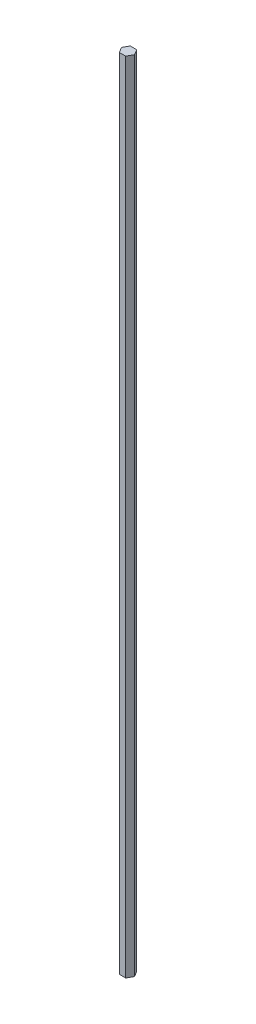
ISO-10303-21;
HEADER;
FILE_DESCRIPTION(('STEP AP214'),'2;1');
FILE_NAME('part.step','',(''),(''),'','','');
FILE_SCHEMA(('AUTOMOTIVE_DESIGN { 1 0 10303 214 1 1 1 1 }'));
ENDSEC;
DATA;
#1=APPLICATION_CONTEXT('core data for automotive mechanical design processes');
#2=APPLICATION_PROTOCOL_DEFINITION('international standard','automotive_design',2000,#1);
#3=PRODUCT_CONTEXT('',#1,'mechanical');
#4=PRODUCT('Part','Part','',(#3));
#5=PRODUCT_RELATED_PRODUCT_CATEGORY('part','',(#4));
#6=PRODUCT_DEFINITION_FORMATION('','',#4);
#7=PRODUCT_DEFINITION_CONTEXT('part definition',#1,'design');
#8=PRODUCT_DEFINITION('design','',#6,#7);
#9=PRODUCT_DEFINITION_SHAPE('','',#8);
#10=(LENGTH_UNIT() NAMED_UNIT(*) SI_UNIT(.MILLI.,.METRE.));
#11=(NAMED_UNIT(*) PLANE_ANGLE_UNIT() SI_UNIT($,.RADIAN.));
#12=(NAMED_UNIT(*) SI_UNIT($,.STERADIAN.) SOLID_ANGLE_UNIT());
#13=UNCERTAINTY_MEASURE_WITH_UNIT(LENGTH_MEASURE(1.E-05),#10,'distance_accuracy_value','');
#14=(GEOMETRIC_REPRESENTATION_CONTEXT(3) GLOBAL_UNCERTAINTY_ASSIGNED_CONTEXT((#13)) GLOBAL_UNIT_ASSIGNED_CONTEXT((#10,
#11,#12)) REPRESENTATION_CONTEXT('',''));
#15=CARTESIAN_POINT('',(0.,0.,0.));
#16=DIRECTION('',(0.,0.,1.));
#17=DIRECTION('',(1.,0.,0.));
#18=AXIS2_PLACEMENT_3D('',#15,#16,#17);
#19=CARTESIAN_POINT('',(3.66617420935418,914.4,6.34999999999994));
#20=DIRECTION('',(-0.866025403784442,0.,-0.499999999999995));
#21=DIRECTION('',(-0.499999999999995,0.,0.866025403784441));
#22=AXIS2_PLACEMENT_3D('',#19,#20,#21);
#23=PLANE('',#22);
#24=DIRECTION('',(0.499999999999995,0.,-0.866025403784442));
#25=VECTOR('',#24,1.);
#26=CARTESIAN_POINT('',(3.66617420935418,0.,6.34999999999994));
#27=LINE('',#26,#25);
#28=CARTESIAN_POINT('',(3.66617420935418,0.,6.34999999999994));
#29=VERTEX_POINT('',#28);
#30=CARTESIAN_POINT('',(7.33234841870822,0.,0.));
#31=VERTEX_POINT('',#30);
#32=EDGE_CURVE('E117',#29,#31,#27,.T.);
#33=ORIENTED_EDGE('',*,*,#32,.T.);
#34=DIRECTION('',(0.,-1.,0.));
#35=VECTOR('',#34,1.);
#36=CARTESIAN_POINT('',(7.33234841870822,914.4,0.));
#37=LINE('',#36,#35);
#38=CARTESIAN_POINT('',(7.33234841870822,914.4,0.));
#39=VERTEX_POINT('',#38);
#40=EDGE_CURVE('E11',#39,#31,#37,.T.);
#41=ORIENTED_EDGE('',*,*,#40,.F.);
#42=DIRECTION('',(0.499999999999995,0.,-0.866025403784442));
#43=VECTOR('',#42,1.);
#44=CARTESIAN_POINT('',(3.66617420935418,914.4,6.34999999999994));
#45=LINE('',#44,#43);
#46=CARTESIAN_POINT('',(3.66617420935418,914.4,6.34999999999994));
#47=VERTEX_POINT('',#46);
#48=EDGE_CURVE('E127',#47,#39,#45,.T.);
#49=ORIENTED_EDGE('',*,*,#48,.F.);
#50=DIRECTION('',(0.,-1.,0.));
#51=VECTOR('',#50,1.);
#52=CARTESIAN_POINT('',(3.66617420935418,914.4,6.34999999999994));
#53=LINE('',#52,#51);
#54=EDGE_CURVE('E113',#47,#29,#53,.T.);
#55=ORIENTED_EDGE('',*,*,#54,.T.);
#56=EDGE_LOOP('',(#33,#41,#49,#55));
#57=FACE_BOUND('',#56,.T.);
#58=ADVANCED_FACE('F33',(#57),#23,.F.);
#59=CARTESIAN_POINT('',(7.33234841870822,914.4,0.));
#60=DIRECTION('',(-0.866025403784438,0.,0.500000000000001));
#61=DIRECTION('',(0.500000000000001,0.,0.866025403784438));
#62=AXIS2_PLACEMENT_3D('',#59,#60,#61);
#63=PLANE('',#62);
#64=DIRECTION('',(-0.500000000000001,0.,-0.866025403784438));
#65=VECTOR('',#64,1.);
#66=CARTESIAN_POINT('',(7.33234841870822,0.,0.));
#67=LINE('',#66,#65);
#68=CARTESIAN_POINT('',(3.6661742093541,0.,-6.34999999999999));
#69=VERTEX_POINT('',#68);
#70=EDGE_CURVE('E120',#31,#69,#67,.T.);
#71=ORIENTED_EDGE('',*,*,#70,.T.);
#72=DIRECTION('',(0.,-1.,0.));
#73=VECTOR('',#72,1.);
#74=CARTESIAN_POINT('',(3.6661742093541,914.4,-6.34999999999999));
#75=LINE('',#74,#73);
#76=CARTESIAN_POINT('',(3.6661742093541,914.4,-6.34999999999999));
#77=VERTEX_POINT('',#76);
#78=EDGE_CURVE('E41',#77,#69,#75,.T.);
#79=ORIENTED_EDGE('',*,*,#78,.F.);
#80=DIRECTION('',(-0.500000000000001,0.,-0.866025403784438));
#81=VECTOR('',#80,1.);
#82=CARTESIAN_POINT('',(7.33234841870822,914.4,0.));
#83=LINE('',#82,#81);
#84=EDGE_CURVE('E86',#39,#77,#83,.T.);
#85=ORIENTED_EDGE('',*,*,#84,.F.);
#86=ORIENTED_EDGE('',*,*,#40,.T.);
#87=EDGE_LOOP('',(#71,#79,#85,#86));
#88=FACE_BOUND('',#87,.T.);
#89=ADVANCED_FACE('F151',(#88),#63,.F.);
#90=CARTESIAN_POINT('',(3.6661742093541,914.4,-6.34999999999999));
#91=DIRECTION('',(0.,0.,1.));
#92=DIRECTION('',(1.,0.,0.));
#93=AXIS2_PLACEMENT_3D('',#90,#91,#92);
#94=PLANE('',#93);
#95=DIRECTION('',(-1.,0.,0.));
#96=VECTOR('',#95,1.);
#97=CARTESIAN_POINT('',(3.6661742093541,0.,-6.34999999999999));
#98=LINE('',#97,#96);
#99=CARTESIAN_POINT('',(-3.66617420935414,0.,-6.34999999999996));
#100=VERTEX_POINT('',#99);
#101=EDGE_CURVE('E122',#69,#100,#98,.T.);
#102=ORIENTED_EDGE('',*,*,#101,.T.);
#103=DIRECTION('',(0.,-1.,0.));
#104=VECTOR('',#103,1.);
#105=CARTESIAN_POINT('',(-3.66617420935414,914.4,-6.34999999999996));
#106=LINE('',#105,#104);
#107=CARTESIAN_POINT('',(-3.66617420935414,914.4,-6.34999999999996));
#108=VERTEX_POINT('',#107);
#109=EDGE_CURVE('E108',#108,#100,#106,.T.);
#110=ORIENTED_EDGE('',*,*,#109,.F.);
#111=DIRECTION('',(-1.,0.,0.));
#112=VECTOR('',#111,1.);
#113=CARTESIAN_POINT('',(3.6661742093541,914.4,-6.34999999999999));
#114=LINE('',#113,#112);
#115=EDGE_CURVE('E99',#77,#108,#114,.T.);
#116=ORIENTED_EDGE('',*,*,#115,.F.);
#117=ORIENTED_EDGE('',*,*,#78,.T.);
#118=EDGE_LOOP('',(#102,#110,#116,#117));
#119=FACE_BOUND('',#118,.T.);
#120=ADVANCED_FACE('F133',(#119),#94,.F.);
#121=CARTESIAN_POINT('',(-3.66617420935414,914.4,-6.34999999999996));
#122=DIRECTION('',(0.866025403784441,0.,0.499999999999995));
#123=DIRECTION('',(0.499999999999995,0.,-0.866025403784442));
#124=AXIS2_PLACEMENT_3D('',#121,#122,#123);
#125=PLANE('',#124);
#126=DIRECTION('',(-0.499999999999995,0.,0.866025403784442));
#127=VECTOR('',#126,1.);
#128=CARTESIAN_POINT('',(-3.66617420935414,0.,-6.34999999999996));
#129=LINE('',#128,#127);
#130=CARTESIAN_POINT('',(-7.33234841870822,0.,0.));
#131=VERTEX_POINT('',#130);
#132=EDGE_CURVE('E107',#100,#131,#129,.T.);
#133=ORIENTED_EDGE('',*,*,#132,.T.);
#134=DIRECTION('',(0.,-1.,0.));
#135=VECTOR('',#134,1.);
#136=CARTESIAN_POINT('',(-7.33234841870822,914.4,0.));
#137=LINE('',#136,#135);
#138=CARTESIAN_POINT('',(-7.33234841870822,914.4,0.));
#139=VERTEX_POINT('',#138);
#140=EDGE_CURVE('E104',#139,#131,#137,.T.);
#141=ORIENTED_EDGE('',*,*,#140,.F.);
#142=DIRECTION('',(-0.499999999999995,0.,0.866025403784442));
#143=VECTOR('',#142,1.);
#144=CARTESIAN_POINT('',(-3.66617420935414,914.4,-6.34999999999996));
#145=LINE('',#144,#143);
#146=EDGE_CURVE('E93',#108,#139,#145,.T.);
#147=ORIENTED_EDGE('',*,*,#146,.F.);
#148=ORIENTED_EDGE('',*,*,#109,.T.);
#149=EDGE_LOOP('',(#133,#141,#147,#148));
#150=FACE_BOUND('',#149,.T.);
#151=ADVANCED_FACE('F105',(#150),#125,.F.);
#152=CARTESIAN_POINT('',(-7.33234841870822,914.4,0.));
#153=DIRECTION('',(0.866025403784434,0.,-0.500000000000007));
#154=DIRECTION('',(-0.500000000000007,0.,-0.866025403784435));
#155=AXIS2_PLACEMENT_3D('',#152,#153,#154);
#156=PLANE('',#155);
#157=DIRECTION('',(0.500000000000007,0.,0.866025403784434));
#158=VECTOR('',#157,1.);
#159=CARTESIAN_POINT('',(-7.33234841870822,0.,0.));
#160=LINE('',#159,#158);
#161=CARTESIAN_POINT('',(-3.66617420935405,0.,6.35000000000001));
#162=VERTEX_POINT('',#161);
#163=EDGE_CURVE('E72',#131,#162,#160,.T.);
#164=ORIENTED_EDGE('',*,*,#163,.T.);
#165=DIRECTION('',(0.,-1.,0.));
#166=VECTOR('',#165,1.);
#167=CARTESIAN_POINT('',(-3.66617420935405,914.4,6.35000000000001));
#168=LINE('',#167,#166);
#169=CARTESIAN_POINT('',(-3.66617420935405,914.4,6.35000000000001));
#170=VERTEX_POINT('',#169);
#171=EDGE_CURVE('E109',#170,#162,#168,.T.);
#172=ORIENTED_EDGE('',*,*,#171,.F.);
#173=DIRECTION('',(0.500000000000007,0.,0.866025403784434));
#174=VECTOR('',#173,1.);
#175=CARTESIAN_POINT('',(-7.33234841870822,914.4,0.));
#176=LINE('',#175,#174);
#177=EDGE_CURVE('E97',#139,#170,#176,.T.);
#178=ORIENTED_EDGE('',*,*,#177,.F.);
#179=ORIENTED_EDGE('',*,*,#140,.T.);
#180=EDGE_LOOP('',(#164,#172,#178,#179));
#181=FACE_BOUND('',#180,.T.);
#182=ADVANCED_FACE('F111',(#181),#156,.F.);
#183=CARTESIAN_POINT('',(-3.66617420935405,914.4,6.35000000000001));
#184=DIRECTION('',(0.,0.,-1.));
#185=DIRECTION('',(-1.,0.,0.));
#186=AXIS2_PLACEMENT_3D('',#183,#184,#185);
#187=PLANE('',#186);
#188=DIRECTION('',(1.,0.,0.));
#189=VECTOR('',#188,1.);
#190=CARTESIAN_POINT('',(-3.66617420935405,0.,6.35000000000001));
#191=LINE('',#190,#189);
#192=EDGE_CURVE('E78',#162,#29,#191,.T.);
#193=ORIENTED_EDGE('',*,*,#192,.T.);
#194=ORIENTED_EDGE('',*,*,#54,.F.);
#195=DIRECTION('',(1.,0.,0.));
#196=VECTOR('',#195,1.);
#197=CARTESIAN_POINT('',(-3.66617420935405,914.4,6.35000000000001));
#198=LINE('',#197,#196);
#199=EDGE_CURVE('E49',#170,#47,#198,.T.);
#200=ORIENTED_EDGE('',*,*,#199,.F.);
#201=ORIENTED_EDGE('',*,*,#171,.T.);
#202=EDGE_LOOP('',(#193,#194,#200,#201));
#203=FACE_BOUND('',#202,.T.);
#204=ADVANCED_FACE('F140',(#203),#187,.F.);
#205=CARTESIAN_POINT('',(0.,914.4,0.));
#206=DIRECTION('',(0.,1.,0.));
#207=DIRECTION('',(0.,0.,1.));
#208=AXIS2_PLACEMENT_3D('',#205,#206,#207);
#209=PLANE('',#208);
#210=ORIENTED_EDGE('',*,*,#48,.T.);
#211=ORIENTED_EDGE('',*,*,#84,.T.);
#212=ORIENTED_EDGE('',*,*,#115,.T.);
#213=ORIENTED_EDGE('',*,*,#146,.T.);
#214=ORIENTED_EDGE('',*,*,#177,.T.);
#215=ORIENTED_EDGE('',*,*,#199,.T.);
#216=EDGE_LOOP('',(#210,#211,#212,#213,#214,#215));
#217=FACE_BOUND('',#216,.T.);
#218=ADVANCED_FACE('F95',(#217),#209,.T.);
#219=CARTESIAN_POINT('',(0.,0.,0.));
#220=DIRECTION('',(0.,1.,0.));
#221=DIRECTION('',(0.,0.,1.));
#222=AXIS2_PLACEMENT_3D('',#219,#220,#221);
#223=PLANE('',#222);
#224=ORIENTED_EDGE('',*,*,#32,.F.);
#225=ORIENTED_EDGE('',*,*,#192,.F.);
#226=ORIENTED_EDGE('',*,*,#163,.F.);
#227=ORIENTED_EDGE('',*,*,#132,.F.);
#228=ORIENTED_EDGE('',*,*,#101,.F.);
#229=ORIENTED_EDGE('',*,*,#70,.F.);
#230=EDGE_LOOP('',(#224,#225,#226,#227,#228,#229));
#231=FACE_BOUND('',#230,.T.);
#232=ADVANCED_FACE('F136',(#231),#223,.F.);
#233=CLOSED_SHELL('',(#58,#89,#120,#151,#182,#204,#218,#232));
#234=MANIFOLD_SOLID_BREP('B2',#233);
#235=ADVANCED_BREP_SHAPE_REPRESENTATION('',(#18,#234),#14);
#236=SHAPE_DEFINITION_REPRESENTATION(#9,#235);
ENDSEC;
END-ISO-10303-21;
